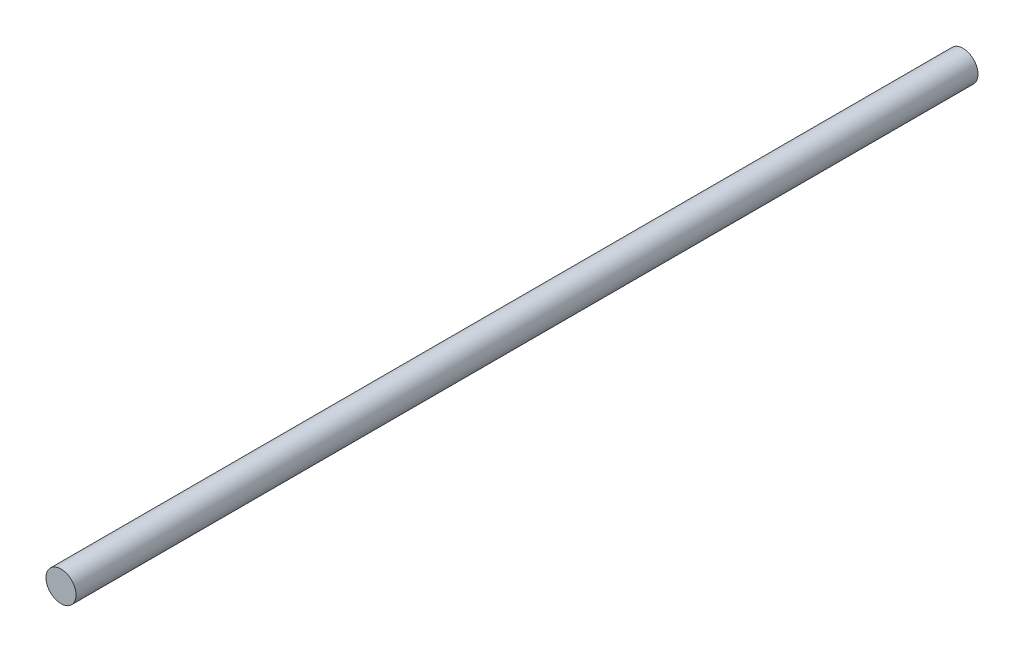
ISO-10303-21;
HEADER;
FILE_DESCRIPTION(('STEP AP214'),'2;1');
FILE_NAME('part.step','',(''),(''),'','','');
FILE_SCHEMA(('AUTOMOTIVE_DESIGN { 1 0 10303 214 1 1 1 1 }'));
ENDSEC;
DATA;
#1=APPLICATION_CONTEXT('core data for automotive mechanical design processes');
#2=APPLICATION_PROTOCOL_DEFINITION('international standard','automotive_design',2000,#1);
#3=PRODUCT_CONTEXT('',#1,'mechanical');
#4=PRODUCT('Part','Part','',(#3));
#5=PRODUCT_RELATED_PRODUCT_CATEGORY('part','',(#4));
#6=PRODUCT_DEFINITION_FORMATION('','',#4);
#7=PRODUCT_DEFINITION_CONTEXT('part definition',#1,'design');
#8=PRODUCT_DEFINITION('design','',#6,#7);
#9=PRODUCT_DEFINITION_SHAPE('','',#8);
#10=(LENGTH_UNIT() NAMED_UNIT(*) SI_UNIT(.MILLI.,.METRE.));
#11=(NAMED_UNIT(*) PLANE_ANGLE_UNIT() SI_UNIT($,.RADIAN.));
#12=(NAMED_UNIT(*) SI_UNIT($,.STERADIAN.) SOLID_ANGLE_UNIT());
#13=UNCERTAINTY_MEASURE_WITH_UNIT(LENGTH_MEASURE(1.E-05),#10,'distance_accuracy_value','');
#14=(GEOMETRIC_REPRESENTATION_CONTEXT(3) GLOBAL_UNCERTAINTY_ASSIGNED_CONTEXT((#13)) GLOBAL_UNIT_ASSIGNED_CONTEXT((#10,
#11,#12)) REPRESENTATION_CONTEXT('',''));
#15=CARTESIAN_POINT('',(0.,0.,0.));
#16=DIRECTION('',(0.,0.,1.));
#17=DIRECTION('',(1.,0.,0.));
#18=AXIS2_PLACEMENT_3D('',#15,#16,#17);
#19=CARTESIAN_POINT('',(0.,0.,150.));
#20=DIRECTION('',(0.,0.,-1.));
#21=DIRECTION('',(-1.,0.,0.));
#22=AXIS2_PLACEMENT_3D('',#19,#20,#21);
#23=CYLINDRICAL_SURFACE('',#22,2.5);
#24=CARTESIAN_POINT('',(0.,0.,150.));
#25=DIRECTION('',(0.,0.,1.));
#26=DIRECTION('',(1.,0.,0.));
#27=AXIS2_PLACEMENT_3D('',#24,#25,#26);
#28=CIRCLE('',#27,2.5);
#29=CARTESIAN_POINT('',(2.5,0.,150.));
#30=VERTEX_POINT('',#29);
#31=EDGE_CURVE('E10',#30,#30,#28,.T.);
#32=ORIENTED_EDGE('',*,*,#31,.F.);
#33=EDGE_LOOP('',(#32));
#34=FACE_BOUND('',#33,.T.);
#35=CARTESIAN_POINT('',(0.,0.,0.));
#36=DIRECTION('',(0.,0.,1.));
#37=DIRECTION('',(1.,0.,0.));
#38=AXIS2_PLACEMENT_3D('',#35,#36,#37);
#39=CIRCLE('',#38,2.5);
#40=CARTESIAN_POINT('',(2.5,0.,0.));
#41=VERTEX_POINT('',#40);
#42=EDGE_CURVE('E40',#41,#41,#39,.T.);
#43=ORIENTED_EDGE('',*,*,#42,.T.);
#44=EDGE_LOOP('',(#43));
#45=FACE_BOUND('',#44,.T.);
#46=ADVANCED_FACE('F37',(#34,#45),#23,.T.);
#47=CARTESIAN_POINT('',(0.,0.,150.));
#48=DIRECTION('',(0.,0.,1.));
#49=DIRECTION('',(1.,0.,0.));
#50=AXIS2_PLACEMENT_3D('',#47,#48,#49);
#51=PLANE('',#50);
#52=ORIENTED_EDGE('',*,*,#31,.T.);
#53=EDGE_LOOP('',(#52));
#54=FACE_BOUND('',#53,.T.);
#55=ADVANCED_FACE('F52',(#54),#51,.T.);
#56=CARTESIAN_POINT('',(0.,0.,0.));
#57=DIRECTION('',(0.,0.,1.));
#58=DIRECTION('',(1.,0.,0.));
#59=AXIS2_PLACEMENT_3D('',#56,#57,#58);
#60=PLANE('',#59);
#61=ORIENTED_EDGE('',*,*,#42,.F.);
#62=EDGE_LOOP('',(#61));
#63=FACE_BOUND('',#62,.T.);
#64=ADVANCED_FACE('F50',(#63),#60,.F.);
#65=CLOSED_SHELL('',(#46,#55,#64));
#66=MANIFOLD_SOLID_BREP('B2',#65);
#67=ADVANCED_BREP_SHAPE_REPRESENTATION('',(#18,#66),#14);
#68=SHAPE_DEFINITION_REPRESENTATION(#9,#67);
ENDSEC;
END-ISO-10303-21;
